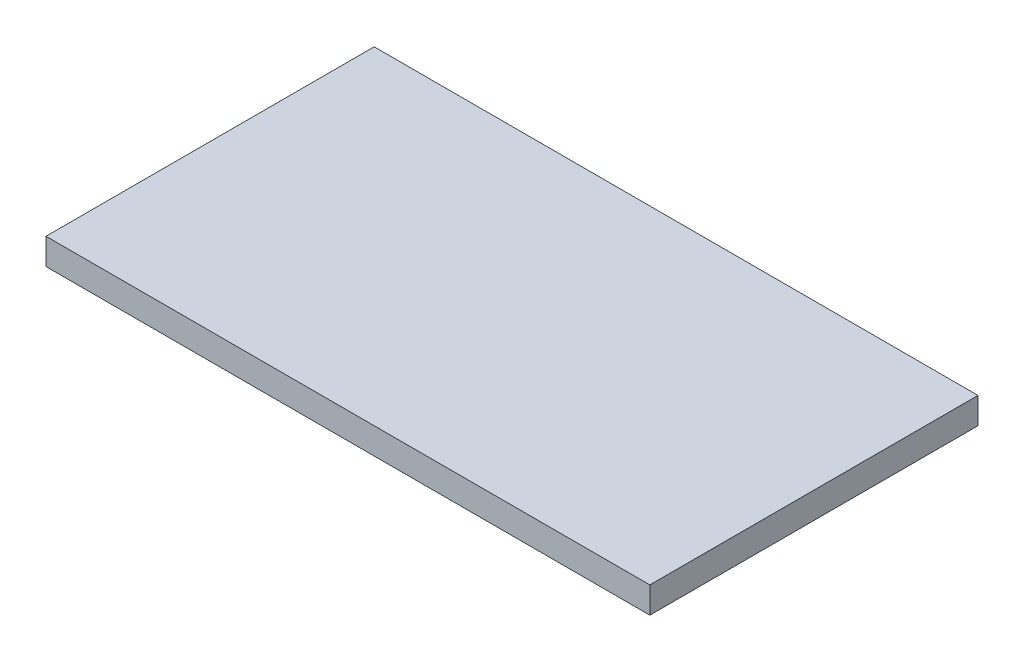
ISO-10303-21;
HEADER;
FILE_DESCRIPTION(('STEP AP214'),'2;1');
FILE_NAME('part.step','',(''),(''),'','','');
FILE_SCHEMA(('AUTOMOTIVE_DESIGN { 1 0 10303 214 1 1 1 1 }'));
ENDSEC;
DATA;
#1=APPLICATION_CONTEXT('core data for automotive mechanical design processes');
#2=APPLICATION_PROTOCOL_DEFINITION('international standard','automotive_design',2000,#1);
#3=PRODUCT_CONTEXT('',#1,'mechanical');
#4=PRODUCT('Part','Part','',(#3));
#5=PRODUCT_RELATED_PRODUCT_CATEGORY('part','',(#4));
#6=PRODUCT_DEFINITION_FORMATION('','',#4);
#7=PRODUCT_DEFINITION_CONTEXT('part definition',#1,'design');
#8=PRODUCT_DEFINITION('design','',#6,#7);
#9=PRODUCT_DEFINITION_SHAPE('','',#8);
#10=(LENGTH_UNIT() NAMED_UNIT(*) SI_UNIT(.MILLI.,.METRE.));
#11=(NAMED_UNIT(*) PLANE_ANGLE_UNIT() SI_UNIT($,.RADIAN.));
#12=(NAMED_UNIT(*) SI_UNIT($,.STERADIAN.) SOLID_ANGLE_UNIT());
#13=UNCERTAINTY_MEASURE_WITH_UNIT(LENGTH_MEASURE(1.E-05),#10,'distance_accuracy_value','');
#14=(GEOMETRIC_REPRESENTATION_CONTEXT(3) GLOBAL_UNCERTAINTY_ASSIGNED_CONTEXT((#13)) GLOBAL_UNIT_ASSIGNED_CONTEXT((#10,
#11,#12)) REPRESENTATION_CONTEXT('',''));
#15=CARTESIAN_POINT('',(0.,0.,0.));
#16=DIRECTION('',(0.,0.,1.));
#17=DIRECTION('',(1.,0.,0.));
#18=AXIS2_PLACEMENT_3D('',#15,#16,#17);
#19=CARTESIAN_POINT('',(-92.,8.,50.));
#20=DIRECTION('',(1.,0.,0.));
#21=DIRECTION('',(0.,0.,1.));
#22=AXIS2_PLACEMENT_3D('',#19,#20,#21);
#23=PLANE('',#22);
#24=DIRECTION('',(0.,0.,-1.));
#25=VECTOR('',#24,1.);
#26=CARTESIAN_POINT('',(-92.,0.,50.));
#27=LINE('',#26,#25);
#28=CARTESIAN_POINT('',(-92.,0.,50.));
#29=VERTEX_POINT('',#28);
#30=CARTESIAN_POINT('',(-92.,0.,-50.));
#31=VERTEX_POINT('',#30);
#32=EDGE_CURVE('E100',#29,#31,#27,.T.);
#33=ORIENTED_EDGE('',*,*,#32,.F.);
#34=DIRECTION('',(0.,-1.,0.));
#35=VECTOR('',#34,1.);
#36=CARTESIAN_POINT('',(-92.,8.,50.));
#37=LINE('',#36,#35);
#38=CARTESIAN_POINT('',(-92.,8.,50.));
#39=VERTEX_POINT('',#38);
#40=EDGE_CURVE('E99',#39,#29,#37,.T.);
#41=ORIENTED_EDGE('',*,*,#40,.F.);
#42=DIRECTION('',(0.,0.,-1.));
#43=VECTOR('',#42,1.);
#44=CARTESIAN_POINT('',(-92.,8.,50.));
#45=LINE('',#44,#43);
#46=CARTESIAN_POINT('',(-92.,8.,-50.));
#47=VERTEX_POINT('',#46);
#48=EDGE_CURVE('E94',#39,#47,#45,.T.);
#49=ORIENTED_EDGE('',*,*,#48,.T.);
#50=DIRECTION('',(0.,-1.,0.));
#51=VECTOR('',#50,1.);
#52=CARTESIAN_POINT('',(-92.,8.,-50.));
#53=LINE('',#52,#51);
#54=EDGE_CURVE('E11',#47,#31,#53,.T.);
#55=ORIENTED_EDGE('',*,*,#54,.T.);
#56=EDGE_LOOP('',(#33,#41,#49,#55));
#57=FACE_BOUND('',#56,.T.);
#58=ADVANCED_FACE('F37',(#57),#23,.F.);
#59=CARTESIAN_POINT('',(92.,8.,-50.));
#60=DIRECTION('',(0.,0.,1.));
#61=DIRECTION('',(-1.,0.,0.));
#62=AXIS2_PLACEMENT_3D('',#59,#60,#61);
#63=PLANE('',#62);
#64=DIRECTION('',(1.,0.,0.));
#65=VECTOR('',#64,1.);
#66=CARTESIAN_POINT('',(92.,0.,-50.));
#67=LINE('',#66,#65);
#68=CARTESIAN_POINT('',(92.,0.,-50.));
#69=VERTEX_POINT('',#68);
#70=EDGE_CURVE('E102',#31,#69,#67,.T.);
#71=ORIENTED_EDGE('',*,*,#70,.F.);
#72=ORIENTED_EDGE('',*,*,#54,.F.);
#73=DIRECTION('',(1.,0.,0.));
#74=VECTOR('',#73,1.);
#75=CARTESIAN_POINT('',(92.,8.,-50.));
#76=LINE('',#75,#74);
#77=CARTESIAN_POINT('',(92.,8.,-50.));
#78=VERTEX_POINT('',#77);
#79=EDGE_CURVE('E78',#47,#78,#76,.T.);
#80=ORIENTED_EDGE('',*,*,#79,.T.);
#81=DIRECTION('',(0.,-1.,0.));
#82=VECTOR('',#81,1.);
#83=CARTESIAN_POINT('',(92.,8.,-50.));
#84=LINE('',#83,#82);
#85=EDGE_CURVE('E45',#78,#69,#84,.T.);
#86=ORIENTED_EDGE('',*,*,#85,.T.);
#87=EDGE_LOOP('',(#71,#72,#80,#86));
#88=FACE_BOUND('',#87,.T.);
#89=ADVANCED_FACE('F92',(#88),#63,.F.);
#90=CARTESIAN_POINT('',(92.,8.,50.));
#91=DIRECTION('',(-1.,0.,0.));
#92=DIRECTION('',(0.,0.,-1.));
#93=AXIS2_PLACEMENT_3D('',#90,#91,#92);
#94=PLANE('',#93);
#95=DIRECTION('',(0.,0.,1.));
#96=VECTOR('',#95,1.);
#97=CARTESIAN_POINT('',(92.,0.,50.));
#98=LINE('',#97,#96);
#99=CARTESIAN_POINT('',(92.,0.,50.));
#100=VERTEX_POINT('',#99);
#101=EDGE_CURVE('E88',#69,#100,#98,.T.);
#102=ORIENTED_EDGE('',*,*,#101,.F.);
#103=ORIENTED_EDGE('',*,*,#85,.F.);
#104=DIRECTION('',(0.,0.,1.));
#105=VECTOR('',#104,1.);
#106=CARTESIAN_POINT('',(92.,8.,50.));
#107=LINE('',#106,#105);
#108=CARTESIAN_POINT('',(92.,8.,50.));
#109=VERTEX_POINT('',#108);
#110=EDGE_CURVE('E81',#78,#109,#107,.T.);
#111=ORIENTED_EDGE('',*,*,#110,.T.);
#112=DIRECTION('',(0.,-1.,0.));
#113=VECTOR('',#112,1.);
#114=CARTESIAN_POINT('',(92.,8.,50.));
#115=LINE('',#114,#113);
#116=EDGE_CURVE('E91',#109,#100,#115,.T.);
#117=ORIENTED_EDGE('',*,*,#116,.T.);
#118=EDGE_LOOP('',(#102,#103,#111,#117));
#119=FACE_BOUND('',#118,.T.);
#120=ADVANCED_FACE('F87',(#119),#94,.F.);
#121=CARTESIAN_POINT('',(92.,8.,50.));
#122=DIRECTION('',(0.,0.,-1.));
#123=DIRECTION('',(1.,0.,0.));
#124=AXIS2_PLACEMENT_3D('',#121,#122,#123);
#125=PLANE('',#124);
#126=DIRECTION('',(-1.,0.,0.));
#127=VECTOR('',#126,1.);
#128=CARTESIAN_POINT('',(92.,0.,50.));
#129=LINE('',#128,#127);
#130=EDGE_CURVE('E67',#100,#29,#129,.T.);
#131=ORIENTED_EDGE('',*,*,#130,.F.);
#132=ORIENTED_EDGE('',*,*,#116,.F.);
#133=DIRECTION('',(-1.,0.,0.));
#134=VECTOR('',#133,1.);
#135=CARTESIAN_POINT('',(92.,8.,50.));
#136=LINE('',#135,#134);
#137=EDGE_CURVE('E53',#109,#39,#136,.T.);
#138=ORIENTED_EDGE('',*,*,#137,.T.);
#139=ORIENTED_EDGE('',*,*,#40,.T.);
#140=EDGE_LOOP('',(#131,#132,#138,#139));
#141=FACE_BOUND('',#140,.T.);
#142=ADVANCED_FACE('F111',(#141),#125,.F.);
#143=CARTESIAN_POINT('',(0.,8.,0.));
#144=DIRECTION('',(0.,-1.,0.));
#145=DIRECTION('',(0.,0.,1.));
#146=AXIS2_PLACEMENT_3D('',#143,#144,#145);
#147=PLANE('',#146);
#148=ORIENTED_EDGE('',*,*,#48,.F.);
#149=ORIENTED_EDGE('',*,*,#137,.F.);
#150=ORIENTED_EDGE('',*,*,#110,.F.);
#151=ORIENTED_EDGE('',*,*,#79,.F.);
#152=EDGE_LOOP('',(#148,#149,#150,#151));
#153=FACE_BOUND('',#152,.T.);
#154=ADVANCED_FACE('F83',(#153),#147,.F.);
#155=CARTESIAN_POINT('',(0.,0.,0.));
#156=DIRECTION('',(0.,-1.,0.));
#157=DIRECTION('',(0.,0.,1.));
#158=AXIS2_PLACEMENT_3D('',#155,#156,#157);
#159=PLANE('',#158);
#160=ORIENTED_EDGE('',*,*,#32,.T.);
#161=ORIENTED_EDGE('',*,*,#70,.T.);
#162=ORIENTED_EDGE('',*,*,#101,.T.);
#163=ORIENTED_EDGE('',*,*,#130,.T.);
#164=EDGE_LOOP('',(#160,#161,#162,#163));
#165=FACE_BOUND('',#164,.T.);
#166=ADVANCED_FACE('F107',(#165),#159,.T.);
#167=CLOSED_SHELL('',(#58,#89,#120,#142,#154,#166));
#168=MANIFOLD_SOLID_BREP('B2',#167);
#169=ADVANCED_BREP_SHAPE_REPRESENTATION('',(#18,#168),#14);
#170=SHAPE_DEFINITION_REPRESENTATION(#9,#169);
ENDSEC;
END-ISO-10303-21;
